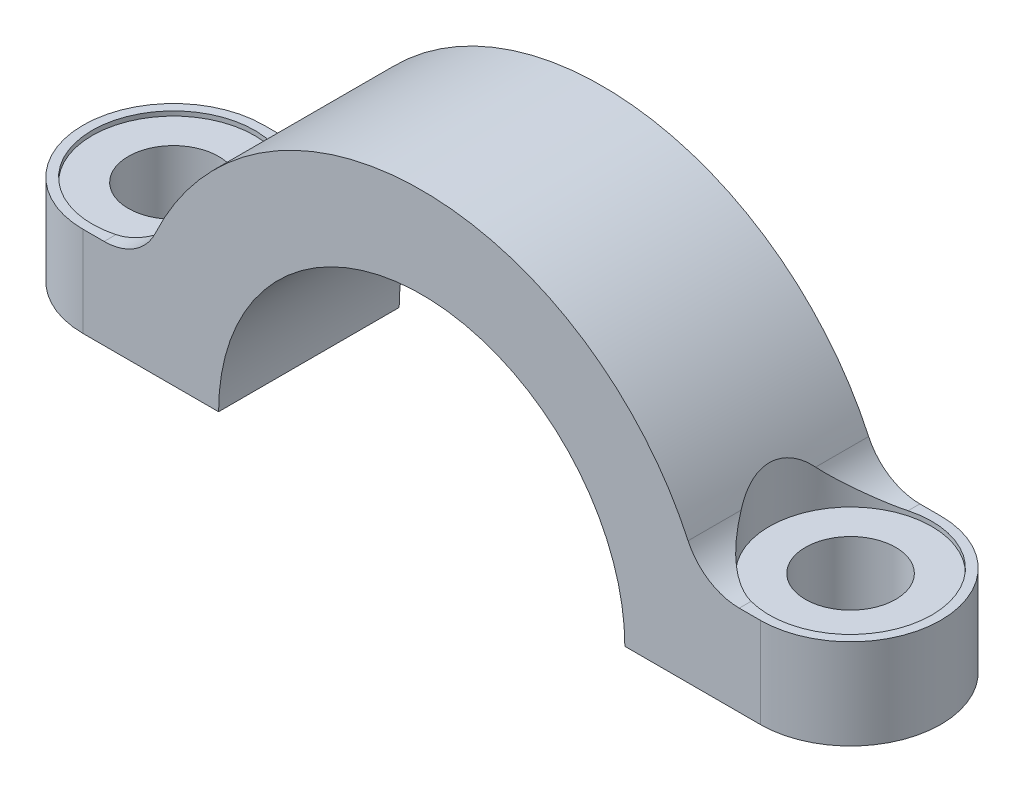
ISO-10303-21;
HEADER;
FILE_DESCRIPTION(('STEP AP214'),'2;1');
FILE_NAME('part.step','',(''),(''),'','','');
FILE_SCHEMA(('AUTOMOTIVE_DESIGN { 1 0 10303 214 1 1 1 1 }'));
ENDSEC;
DATA;
#1=APPLICATION_CONTEXT('core data for automotive mechanical design processes');
#2=APPLICATION_PROTOCOL_DEFINITION('international standard','automotive_design',2000,#1);
#3=PRODUCT_CONTEXT('',#1,'mechanical');
#4=PRODUCT('Part','Part','',(#3));
#5=PRODUCT_RELATED_PRODUCT_CATEGORY('part','',(#4));
#6=PRODUCT_DEFINITION_FORMATION('','',#4);
#7=PRODUCT_DEFINITION_CONTEXT('part definition',#1,'design');
#8=PRODUCT_DEFINITION('design','',#6,#7);
#9=PRODUCT_DEFINITION_SHAPE('','',#8);
#10=(LENGTH_UNIT() NAMED_UNIT(*) SI_UNIT(.MILLI.,.METRE.));
#11=(NAMED_UNIT(*) PLANE_ANGLE_UNIT() SI_UNIT($,.RADIAN.));
#12=(NAMED_UNIT(*) SI_UNIT($,.STERADIAN.) SOLID_ANGLE_UNIT());
#13=UNCERTAINTY_MEASURE_WITH_UNIT(LENGTH_MEASURE(1.E-05),#10,'distance_accuracy_value','');
#14=(GEOMETRIC_REPRESENTATION_CONTEXT(3) GLOBAL_UNCERTAINTY_ASSIGNED_CONTEXT((#13)) GLOBAL_UNIT_ASSIGNED_CONTEXT((#10,
#11,#12)) REPRESENTATION_CONTEXT('',''));
#15=CARTESIAN_POINT('',(0.,0.,0.));
#16=DIRECTION('',(0.,0.,1.));
#17=DIRECTION('',(1.,0.,0.));
#18=AXIS2_PLACEMENT_3D('',#15,#16,#17);
#19=CARTESIAN_POINT('',(14.0712472794703,6.5,4.));
#20=DIRECTION('',(0.,0.,-1.));
#21=DIRECTION('',(-1.,0.,0.));
#22=AXIS2_PLACEMENT_3D('',#19,#20,#21);
#23=CYLINDRICAL_SURFACE('',#22,2.5);
#24=CARTESIAN_POINT('',(11.8016912666525,5.45161290322581,1.65251966590207));
#25=CARTESIAN_POINT('',(11.8188289746263,5.41452420369606,1.68569339481371));
#26=CARTESIAN_POINT('',(11.8367686755661,5.3780649501407,1.71914330040094));
#27=CARTESIAN_POINT('',(11.8742559931517,5.3063196638288,1.78639364698117));
#28=CARTESIAN_POINT('',(11.8938034999538,5.27103355115527,1.82019406388991));
#29=CARTESIAN_POINT('',(11.9548915904636,5.16675750836371,1.92186570037148));
#30=CARTESIAN_POINT('',(11.9988573042518,5.09939392837527,1.98996723746635));
#31=CARTESIAN_POINT('',(12.0937907115289,4.9682446602968,2.12624378968797));
#32=CARTESIAN_POINT('',(12.144819167192,4.90449764120915,2.19441370426769));
#33=CARTESIAN_POINT('',(12.2537120050401,4.78148091019149,2.32925150995004));
#34=CARTESIAN_POINT('',(12.3115741377295,4.72220973538662,2.39591988676886));
#35=CARTESIAN_POINT('',(12.4737368523032,4.57209028407437,2.5689900602577));
#36=CARTESIAN_POINT('',(12.5840339669892,4.48534818048161,2.67347470244523));
#37=CARTESIAN_POINT('',(12.8238677149758,4.32872273657087,2.87203100536794));
#38=CARTESIAN_POINT('',(12.9533455477352,4.25878952732398,2.96613300859957));
#39=CARTESIAN_POINT('',(13.2007259713607,4.15348331978466,3.12074482179418));
#40=CARTESIAN_POINT('',(13.3150405588784,4.11390357215417,3.18411250532934));
#41=CARTESIAN_POINT('',(13.5534866088813,4.0511189168058,3.29924144741269));
#42=CARTESIAN_POINT('',(13.6775916068689,4.02787144143483,3.3510326360635));
#43=CARTESIAN_POINT('',(13.8486925577638,4.00953571992758,3.41125450979519));
#44=CARTESIAN_POINT('',(13.8927666825841,4.00598196212824,3.4258137904709));
#45=CARTESIAN_POINT('',(13.9815577683437,4.0012147374168,3.4532488971905));
#46=CARTESIAN_POINT('',(14.0262746996844,4.00000116309398,3.46612480047347));
#47=CARTESIAN_POINT('',(14.0712472794703,3.9999999999999,3.47813432519632));
#48=B_SPLINE_CURVE_WITH_KNOTS('',3,(#24,#25,#26,#27,#28,#29,#30,#31,#32,#33,#34,#35,#36,#37,#38,
#39,#40,#41,#42,#43,#44,#45,#46,#47),.UNSPECIFIED.,.F.,.F.,(4,2,2,2,2,2,2,2,2,2,2,4),(0.,
0.157860585988416,0.315710396031228,0.631598419231587,0.950395939136866,1.26908880891188,
1.79201855633125,2.31337716780999,2.72156767446074,3.12869030591443,3.26827336571579,
3.40785001872314),.UNSPECIFIED.);
#49=CARTESIAN_POINT('',(11.8016912666525,5.4516129032258,1.65251966590207));
#50=VERTEX_POINT('',#49);
#51=CARTESIAN_POINT('',(14.0712472794703,4.,3.47813432519629));
#52=VERTEX_POINT('',#51);
#53=EDGE_CURVE('E263',#50,#52,#48,.T.);
#54=ORIENTED_EDGE('',*,*,#53,.F.);
#55=DIRECTION('',(0.,0.,-1.));
#56=VECTOR('',#55,1.);
#57=CARTESIAN_POINT('',(11.8016912666525,5.45161290322581,4.));
#58=LINE('',#57,#56);
#59=CARTESIAN_POINT('',(11.8016912666525,5.45161290322581,4.));
#60=VERTEX_POINT('',#59);
#61=EDGE_CURVE('E176',#60,#50,#58,.T.);
#62=ORIENTED_EDGE('',*,*,#61,.F.);
#63=CARTESIAN_POINT('',(14.0712472794703,6.5,4.));
#64=DIRECTION('',(0.,0.,-1.));
#65=DIRECTION('',(-1.,0.,0.));
#66=AXIS2_PLACEMENT_3D('',#63,#64,#65);
#67=CIRCLE('',#66,2.5);
#68=CARTESIAN_POINT('',(14.0712472794703,4.,4.));
#69=VERTEX_POINT('',#68);
#70=EDGE_CURVE('E280',#69,#60,#67,.T.);
#71=ORIENTED_EDGE('',*,*,#70,.F.);
#72=DIRECTION('',(0.,0.,-1.));
#73=VECTOR('',#72,1.);
#74=CARTESIAN_POINT('',(14.0712472794703,4.,4.));
#75=LINE('',#74,#73);
#76=EDGE_CURVE('E180',#69,#52,#75,.T.);
#77=ORIENTED_EDGE('',*,*,#76,.T.);
#78=EDGE_LOOP('',(#54,#62,#71,#77));
#79=FACE_BOUND('',#78,.T.);
#80=ADVANCED_FACE('F41',(#79),#23,.F.);
#81=CARTESIAN_POINT('',(14.0712472794703,4.,-3.4781343251963));
#82=CARTESIAN_POINT('',(14.0032319986114,3.9999879130768,-3.45998969483515));
#83=CARTESIAN_POINT('',(13.9357895006218,4.00277469817216,-3.43982717035992));
#84=CARTESIAN_POINT('',(13.8026519717465,4.01357792717883,-3.39576739876574));
#85=CARTESIAN_POINT('',(13.7369548763053,4.02158787740242,-3.3718748170481));
#86=CARTESIAN_POINT('',(13.6083584672097,4.04237095535814,-3.3208554956094));
#87=CARTESIAN_POINT('',(13.5454383602942,4.05509765294117,-3.29376197979607));
#88=CARTESIAN_POINT('',(13.4220903534515,4.0849172375046,-3.23648440923201));
#89=CARTESIAN_POINT('',(13.3616631839194,4.10201139368336,-3.20629945762985));
#90=CARTESIAN_POINT('',(13.1851558289351,4.15904658994398,-3.1119193230719));
#91=CARTESIAN_POINT('',(13.0731106375179,4.20486806637085,-3.04360078764602));
#92=CARTESIAN_POINT('',(12.8608810391779,4.30931925386273,-2.89841713023571));
#93=CARTESIAN_POINT('',(12.7607369051065,4.36799064584802,-2.82152460499327));
#94=CARTESIAN_POINT('',(12.5223184540677,4.52989626190688,-2.61858113899498));
#95=CARTESIAN_POINT('',(12.3923603348274,4.64016461680518,-2.4882640176697));
#96=CARTESIAN_POINT('',(12.2186739464261,4.81925771350425,-2.28738086447932));
#97=CARTESIAN_POINT('',(12.1642914693542,4.88128256303884,-2.21947203744772));
#98=CARTESIAN_POINT('',(12.0623497656172,5.00968338209213,-2.08265866660381));
#99=CARTESIAN_POINT('',(12.0147873287778,5.07605728294693,-2.01375460816731));
#100=CARTESIAN_POINT('',(11.9389915577287,5.19352180296022,-1.89569029426439));
#101=CARTESIAN_POINT('',(11.9091198004615,5.24355638584064,-1.84651759714745));
#102=CARTESIAN_POINT('',(11.8528488763825,5.34584343690724,-1.74889129918759));
#103=CARTESIAN_POINT('',(11.8264385045383,5.39808798609242,-1.70043585231196));
#104=CARTESIAN_POINT('',(11.8016912666525,5.45161290322581,-1.65251966590208));
#105=B_SPLINE_CURVE_WITH_KNOTS('',3,(#81,#82,#83,#84,#85,#86,#87,#88,#89,#90,#91,#92,#93,#94,
#95,#96,#97,#98,#99,#100,#101,#102,#103,#104),.UNSPECIFIED.,.F.,.F.,(4,2,2,2,2,2,2,2,2,2,2,4),
(0.,0.211046299428013,0.421830715012293,0.630593081425127,0.839416184034417,1.25466964164437,
1.67129053834591,2.31111768515721,2.63145367130033,2.95163837770608,3.18027941162568,
3.40816098787586),.UNSPECIFIED.);
#106=CARTESIAN_POINT('',(14.0712472794703,4.,-3.4781343251963));
#107=VERTEX_POINT('',#106);
#108=CARTESIAN_POINT('',(11.8016912666525,5.45161290322581,-1.65251966590208));
#109=VERTEX_POINT('',#108);
#110=EDGE_CURVE('E62',#107,#109,#105,.T.);
#111=ORIENTED_EDGE('',*,*,#110,.F.);
#112=CARTESIAN_POINT('',(14.0712472794703,4.,-4.));
#113=VERTEX_POINT('',#112);
#114=EDGE_CURVE('E179',#107,#113,#75,.T.);
#115=ORIENTED_EDGE('',*,*,#114,.T.);
#116=CARTESIAN_POINT('',(14.0712472794703,6.5,-4.));
#117=DIRECTION('',(0.,0.,-1.));
#118=DIRECTION('',(-1.,0.,0.));
#119=AXIS2_PLACEMENT_3D('',#116,#117,#118);
#120=CIRCLE('',#119,2.5);
#121=CARTESIAN_POINT('',(11.8016912666525,5.45161290322581,-4.));
#122=VERTEX_POINT('',#121);
#123=EDGE_CURVE('E298',#113,#122,#120,.T.);
#124=ORIENTED_EDGE('',*,*,#123,.T.);
#125=EDGE_CURVE('E175',#109,#122,#58,.T.);
#126=ORIENTED_EDGE('',*,*,#125,.F.);
#127=EDGE_LOOP('',(#111,#115,#124,#126));
#128=FACE_BOUND('',#127,.T.);
#129=ADVANCED_FACE('F259',(#128),#23,.F.);
#130=CARTESIAN_POINT('',(-14.0712472794703,6.5,4.));
#131=DIRECTION('',(0.,0.,-1.));
#132=DIRECTION('',(-1.,0.,0.));
#133=AXIS2_PLACEMENT_3D('',#130,#131,#132);
#134=CYLINDRICAL_SURFACE('',#133,2.5);
#135=CARTESIAN_POINT('',(-14.0712472794703,4.,3.47813432519629));
#136=CARTESIAN_POINT('',(-14.0032319986114,3.99998791307681,3.45998969483515));
#137=CARTESIAN_POINT('',(-13.9357895006218,4.00277469817216,3.43982717035992));
#138=CARTESIAN_POINT('',(-13.8026519717465,4.01357792717883,3.39576739876573));
#139=CARTESIAN_POINT('',(-13.7369548763053,4.02158787740242,3.3718748170481));
#140=CARTESIAN_POINT('',(-13.6083584672097,4.04237095535814,3.3208554956094));
#141=CARTESIAN_POINT('',(-13.5454383602942,4.05509765294117,3.29376197979606));
#142=CARTESIAN_POINT('',(-13.4220903534515,4.0849172375046,3.23648440923201));
#143=CARTESIAN_POINT('',(-13.3616631839194,4.10201139368336,3.20629945762985));
#144=CARTESIAN_POINT('',(-13.1851558289351,4.15904658994398,3.1119193230719));
#145=CARTESIAN_POINT('',(-13.0731106375179,4.20486806637085,3.04360078764602));
#146=CARTESIAN_POINT('',(-12.8608810391779,4.30931925386273,2.89841713023571));
#147=CARTESIAN_POINT('',(-12.7607369051065,4.36799064584801,2.82152460499327));
#148=CARTESIAN_POINT('',(-12.5223184540677,4.52989626190687,2.61858113899498));
#149=CARTESIAN_POINT('',(-12.3923603348274,4.64016461680518,2.4882640176697));
#150=CARTESIAN_POINT('',(-12.2186739464261,4.81925771350424,2.28738086447932));
#151=CARTESIAN_POINT('',(-12.1642914693542,4.88128256303884,2.21947203744771));
#152=CARTESIAN_POINT('',(-12.0623497656172,5.00968338209213,2.0826586666038));
#153=CARTESIAN_POINT('',(-12.0147873287778,5.07605728294693,2.01375460816731));
#154=CARTESIAN_POINT('',(-11.9389915577287,5.19352180296022,1.89569029426439));
#155=CARTESIAN_POINT('',(-11.9091198004615,5.24355638584065,1.84651759714745));
#156=CARTESIAN_POINT('',(-11.8528488763825,5.34584343690724,1.74889129918759));
#157=CARTESIAN_POINT('',(-11.8264385045383,5.39808798609242,1.70043585231196));
#158=CARTESIAN_POINT('',(-11.8016912666525,5.45161290322581,1.65251966590208));
#159=B_SPLINE_CURVE_WITH_KNOTS('',3,(#135,#136,#137,#138,#139,#140,#141,#142,#143,#144,#145,
#146,#147,#148,#149,#150,#151,#152,#153,#154,#155,#156,#157,#158),.UNSPECIFIED.,.F.,.F.,(4,2,2,
2,2,2,2,2,2,2,2,4),(0.,0.211046299428015,0.421830715012293,0.630593081425129,0.839416184034417,
1.25466964164437,1.6712905383459,2.31111768515721,2.63145367130032,2.95163837770608,
3.18027941162569,3.40816098787587),.UNSPECIFIED.);
#160=CARTESIAN_POINT('',(-14.0712472794703,4.,3.47813432519629));
#161=VERTEX_POINT('',#160);
#162=CARTESIAN_POINT('',(-11.8016912666525,5.45161290322581,1.65251966590208));
#163=VERTEX_POINT('',#162);
#164=EDGE_CURVE('E147',#161,#163,#159,.T.);
#165=ORIENTED_EDGE('',*,*,#164,.F.);
#166=DIRECTION('',(0.,0.,-1.));
#167=VECTOR('',#166,1.);
#168=CARTESIAN_POINT('',(-14.0712472794703,4.,4.));
#169=LINE('',#168,#167);
#170=CARTESIAN_POINT('',(-14.0712472794703,4.,4.));
#171=VERTEX_POINT('',#170);
#172=EDGE_CURVE('E158',#171,#161,#169,.T.);
#173=ORIENTED_EDGE('',*,*,#172,.F.);
#174=CARTESIAN_POINT('',(-14.0712472794703,6.5,4.));
#175=DIRECTION('',(0.,0.,-1.));
#176=DIRECTION('',(-1.,0.,0.));
#177=AXIS2_PLACEMENT_3D('',#174,#175,#176);
#178=CIRCLE('',#177,2.5);
#179=CARTESIAN_POINT('',(-11.8016912666525,5.45161290322581,4.));
#180=VERTEX_POINT('',#179);
#181=EDGE_CURVE('E285',#180,#171,#178,.T.);
#182=ORIENTED_EDGE('',*,*,#181,.F.);
#183=DIRECTION('',(0.,0.,-1.));
#184=VECTOR('',#183,1.);
#185=CARTESIAN_POINT('',(-11.8016912666525,5.45161290322581,4.));
#186=LINE('',#185,#184);
#187=EDGE_CURVE('E161',#180,#163,#186,.T.);
#188=ORIENTED_EDGE('',*,*,#187,.T.);
#189=EDGE_LOOP('',(#165,#173,#182,#188));
#190=FACE_BOUND('',#189,.T.);
#191=ADVANCED_FACE('F156',(#190),#134,.F.);
#192=CARTESIAN_POINT('',(-11.8016912666525,5.45161290322581,-1.65251966590208));
#193=CARTESIAN_POINT('',(-11.8188289746263,5.41452420369607,-1.68569339481372));
#194=CARTESIAN_POINT('',(-11.8367686755661,5.3780649501407,-1.71914330040095));
#195=CARTESIAN_POINT('',(-11.8742559931517,5.3063196638288,-1.78639364698118));
#196=CARTESIAN_POINT('',(-11.8938034999538,5.27103355115527,-1.82019406388992));
#197=CARTESIAN_POINT('',(-11.9548915904636,5.16675750836371,-1.92186570037149));
#198=CARTESIAN_POINT('',(-11.9988573042518,5.09939392837527,-1.98996723746635));
#199=CARTESIAN_POINT('',(-12.0937907115289,4.9682446602968,-2.12624378968798));
#200=CARTESIAN_POINT('',(-12.144819167192,4.90449764120915,-2.19441370426769));
#201=CARTESIAN_POINT('',(-12.2537120050401,4.78148091019149,-2.32925150995005));
#202=CARTESIAN_POINT('',(-12.3115741377295,4.72220973538662,-2.39591988676887));
#203=CARTESIAN_POINT('',(-12.4737368523032,4.57209028407438,-2.56899006025771));
#204=CARTESIAN_POINT('',(-12.5840339669892,4.48534818048161,-2.67347470244523));
#205=CARTESIAN_POINT('',(-12.8238677149758,4.32872273657087,-2.87203100536795));
#206=CARTESIAN_POINT('',(-12.9533455477352,4.25878952732398,-2.96613300859957));
#207=CARTESIAN_POINT('',(-13.2007259713607,4.15348331978466,-3.12074482179419));
#208=CARTESIAN_POINT('',(-13.3150405588784,4.11390357215417,-3.18411250532935));
#209=CARTESIAN_POINT('',(-13.5534866088813,4.0511189168058,-3.2992414474127));
#210=CARTESIAN_POINT('',(-13.6775916068689,4.02787144143483,-3.3510326360635));
#211=CARTESIAN_POINT('',(-13.8486925577638,4.00953571992758,-3.41125450979519));
#212=CARTESIAN_POINT('',(-13.8927666825841,4.00598196212824,-3.4258137904709));
#213=CARTESIAN_POINT('',(-13.9815577683437,4.0012147374168,-3.45324889719051));
#214=CARTESIAN_POINT('',(-14.0262746996844,4.00000116309398,-3.46612480047348));
#215=CARTESIAN_POINT('',(-14.0712472794703,3.9999999999999,-3.47813432519633));
#216=B_SPLINE_CURVE_WITH_KNOTS('',3,(#192,#193,#194,#195,#196,#197,#198,#199,#200,#201,#202,
#203,#204,#205,#206,#207,#208,#209,#210,#211,#212,#213,#214,#215),.UNSPECIFIED.,.F.,.F.,(4,2,2,
2,2,2,2,2,2,2,2,4),(0.,0.157860585988416,0.315710396031228,0.631598419231587,0.950395939136867,
1.26908880891188,1.79201855633125,2.31337716780999,2.72156767446073,3.12869030591443,
3.26827336571579,3.40785001872315),.UNSPECIFIED.);
#217=CARTESIAN_POINT('',(-11.8016912666525,5.45161290322581,-1.65251966590208));
#218=VERTEX_POINT('',#217);
#219=CARTESIAN_POINT('',(-14.0712472794703,4.,-3.47813432519629));
#220=VERTEX_POINT('',#219);
#221=EDGE_CURVE('E70',#218,#220,#216,.T.);
#222=ORIENTED_EDGE('',*,*,#221,.F.);
#223=CARTESIAN_POINT('',(-11.8016912666525,5.45161290322581,-4.));
#224=VERTEX_POINT('',#223);
#225=EDGE_CURVE('E167',#218,#224,#186,.T.);
#226=ORIENTED_EDGE('',*,*,#225,.T.);
#227=CARTESIAN_POINT('',(-14.0712472794703,6.5,-4.));
#228=DIRECTION('',(0.,0.,-1.));
#229=DIRECTION('',(-1.,0.,0.));
#230=AXIS2_PLACEMENT_3D('',#227,#228,#229);
#231=CIRCLE('',#230,2.5);
#232=CARTESIAN_POINT('',(-14.0712472794703,4.,-4.));
#233=VERTEX_POINT('',#232);
#234=EDGE_CURVE('E304',#224,#233,#231,.T.);
#235=ORIENTED_EDGE('',*,*,#234,.T.);
#236=EDGE_CURVE('E168',#220,#233,#169,.T.);
#237=ORIENTED_EDGE('',*,*,#236,.F.);
#238=EDGE_LOOP('',(#222,#226,#235,#237));
#239=FACE_BOUND('',#238,.T.);
#240=ADVANCED_FACE('F253',(#239),#134,.F.);
#241=CARTESIAN_POINT('',(0.,0.,4.));
#242=DIRECTION('',(0.,0.,-1.));
#243=DIRECTION('',(-1.,0.,0.));
#244=AXIS2_PLACEMENT_3D('',#241,#242,#243);
#245=CYLINDRICAL_SURFACE('',#244,13.);
#246=CARTESIAN_POINT('',(-11.8016912666525,5.45161290322581,1.65251966590208));
#247=CARTESIAN_POINT('',(-11.7619137019363,5.53780814362832,1.57548012476357));
#248=CARTESIAN_POINT('',(-11.7227848091341,5.61994684893184,1.49296699320704));
#249=CARTESIAN_POINT('',(-11.6476849009631,5.77396122889819,1.31582824393827));
#250=CARTESIAN_POINT('',(-11.6117546383982,5.84571022590225,1.22107610769326));
#251=CARTESIAN_POINT('',(-11.5457206433814,5.97509091428311,1.01942726082592));
#252=CARTESIAN_POINT('',(-11.5156530625301,6.03263556078395,0.912461271660976));
#253=CARTESIAN_POINT('',(-11.4646576493945,6.12899752853031,0.688776664422131));
#254=CARTESIAN_POINT('',(-11.443690017605,6.16789647822427,0.572103229712973));
#255=CARTESIAN_POINT('',(-11.4143109780329,6.22209106245833,0.339990524297711));
#256=CARTESIAN_POINT('',(-11.4051657434658,6.23876837591726,0.224972911142452));
#257=CARTESIAN_POINT('',(-11.3981460398666,6.25158677184615,-0.00661837344641237));
#258=CARTESIAN_POINT('',(-11.4002732793139,6.24772474133057,-0.123192278083928));
#259=CARTESIAN_POINT('',(-11.4143437284637,6.22196930548397,-0.335672743006501));
#260=CARTESIAN_POINT('',(-11.4247566357726,6.20288593907618,-0.43204264364342));
#261=CARTESIAN_POINT('',(-11.4525292435083,6.1514570542709,-0.620071207165806));
#262=CARTESIAN_POINT('',(-11.4698892941514,6.11911086727213,-0.711729632275614));
#263=CARTESIAN_POINT('',(-11.5165752297443,6.03089411022247,-0.916499643465017));
#264=CARTESIAN_POINT('',(-11.5479462304932,5.97082766737508,-1.02732801334705));
#265=CARTESIAN_POINT('',(-11.6172389103602,5.83485729068521,-1.23658587435948));
#266=CARTESIAN_POINT('',(-11.6551732479249,5.75892269264222,-1.33499075844268));
#267=CARTESIAN_POINT('',(-11.7121981947765,5.64145297615188,-1.46705598368692));
#268=CARTESIAN_POINT('',(-11.7298034915953,5.60477036893255,-1.50584029634812));
#269=CARTESIAN_POINT('',(-11.7654465758293,5.52955602870316,-1.58094256149348));
#270=CARTESIAN_POINT('',(-11.7834818103125,5.49103427739538,-1.61727170591447));
#271=CARTESIAN_POINT('',(-11.8016912666525,5.45161290322581,-1.65251966590208));
#272=B_SPLINE_CURVE_WITH_KNOTS('',3,(#246,#247,#248,#249,#250,#251,#252,#253,#254,#255,#256,
#257,#258,#259,#260,#261,#262,#263,#264,#265,#266,#267,#268,#269,#270,#271),.UNSPECIFIED.,.F.,
.F.,(4,2,2,2,2,2,2,2,2,2,2,2,4),(0.,0.367165135052668,0.738485813181745,1.11202841753501,
1.48392041698507,1.83140227606247,2.17893680171119,2.47400731495714,2.76909270503727,
3.15669052659331,3.54504439978402,3.71361625158862,3.88135903120989),.UNSPECIFIED.);
#273=EDGE_CURVE('E162',#163,#218,#272,.T.);
#274=ORIENTED_EDGE('',*,*,#273,.F.);
#275=ORIENTED_EDGE('',*,*,#187,.F.);
#276=CARTESIAN_POINT('',(0.,0.,4.));
#277=DIRECTION('',(0.,0.,1.));
#278=DIRECTION('',(1.,0.,0.));
#279=AXIS2_PLACEMENT_3D('',#276,#277,#278);
#280=CIRCLE('',#279,13.);
#281=EDGE_CURVE('E283',#60,#180,#280,.T.);
#282=ORIENTED_EDGE('',*,*,#281,.F.);
#283=ORIENTED_EDGE('',*,*,#61,.T.);
#284=CARTESIAN_POINT('',(11.8016912666525,5.4516129032258,-1.65251966590208));
#285=CARTESIAN_POINT('',(11.7619137019363,5.53780814362832,-1.57548012476358));
#286=CARTESIAN_POINT('',(11.7227848091341,5.61994684893184,-1.49296699320705));
#287=CARTESIAN_POINT('',(11.6476849009631,5.77396122889819,-1.31582824393828));
#288=CARTESIAN_POINT('',(11.6117546383982,5.84571022590224,-1.22107610769326));
#289=CARTESIAN_POINT('',(11.5457206433814,5.97509091428311,-1.01942726082592));
#290=CARTESIAN_POINT('',(11.5156530625301,6.03263556078395,-0.912461271660981));
#291=CARTESIAN_POINT('',(11.4646576493945,6.12899752853031,-0.688776664422137));
#292=CARTESIAN_POINT('',(11.443690017605,6.16789647822427,-0.572103229712979));
#293=CARTESIAN_POINT('',(11.4143109780329,6.22209106245833,-0.339990524297717));
#294=CARTESIAN_POINT('',(11.4051657434658,6.23876837591726,-0.224972911142458));
#295=CARTESIAN_POINT('',(11.3981460398666,6.25158677184615,0.00661837344640615));
#296=CARTESIAN_POINT('',(11.4002732793139,6.24772474133057,0.123192278083922));
#297=CARTESIAN_POINT('',(11.4143437284637,6.22196930548396,0.335672743006495));
#298=CARTESIAN_POINT('',(11.4247566357726,6.20288593907617,0.432042643643414));
#299=CARTESIAN_POINT('',(11.4525292435083,6.1514570542709,0.6200712071658));
#300=CARTESIAN_POINT('',(11.4698892941514,6.11911086727213,0.711729632275607));
#301=CARTESIAN_POINT('',(11.5165752297443,6.03089411022247,0.91649964346501));
#302=CARTESIAN_POINT('',(11.5479462304932,5.97082766737508,1.02732801334705));
#303=CARTESIAN_POINT('',(11.6172389103602,5.83485729068521,1.23658587435947));
#304=CARTESIAN_POINT('',(11.6551732479249,5.75892269264222,1.33499075844267));
#305=CARTESIAN_POINT('',(11.7121981947765,5.64145297615188,1.46705598368691));
#306=CARTESIAN_POINT('',(11.7298034915953,5.60477036893255,1.50584029634812));
#307=CARTESIAN_POINT('',(11.7654465758293,5.52955602870316,1.58094256149347));
#308=CARTESIAN_POINT('',(11.7834818103125,5.49103427739538,1.61727170591447));
#309=CARTESIAN_POINT('',(11.8016912666525,5.4516129032258,1.65251966590207));
#310=B_SPLINE_CURVE_WITH_KNOTS('',3,(#284,#285,#286,#287,#288,#289,#290,#291,#292,#293,#294,
#295,#296,#297,#298,#299,#300,#301,#302,#303,#304,#305,#306,#307,#308,#309),.UNSPECIFIED.,.F.,
.F.,(4,2,2,2,2,2,2,2,2,2,2,2,4),(0.,0.367165135052668,0.738485813181745,1.11202841753501,
1.48392041698507,1.83140227606247,2.17893680171119,2.47400731495714,2.76909270503727,
3.1566905265933,3.54504439978402,3.71361625158862,3.88135903120989),.UNSPECIFIED.);
#311=EDGE_CURVE('E11',#109,#50,#310,.T.);
#312=ORIENTED_EDGE('',*,*,#311,.F.);
#313=ORIENTED_EDGE('',*,*,#125,.T.);
#314=CARTESIAN_POINT('',(0.,0.,-4.));
#315=DIRECTION('',(0.,0.,1.));
#316=DIRECTION('',(1.,0.,0.));
#317=AXIS2_PLACEMENT_3D('',#314,#315,#316);
#318=CIRCLE('',#317,13.);
#319=EDGE_CURVE('E301',#122,#224,#318,.T.);
#320=ORIENTED_EDGE('',*,*,#319,.T.);
#321=ORIENTED_EDGE('',*,*,#225,.F.);
#322=EDGE_LOOP('',(#274,#275,#282,#283,#312,#313,#320,#321));
#323=FACE_BOUND('',#322,.T.);
#324=ADVANCED_FACE('F249',(#323),#245,.T.);
#325=CARTESIAN_POINT('',(15.,8.,0.));
#326=DIRECTION('',(0.,-1.,0.));
#327=DIRECTION('',(0.,0.,-1.));
#328=AXIS2_PLACEMENT_3D('',#325,#326,#327);
#329=CYLINDRICAL_SURFACE('',#328,2.);
#330=CARTESIAN_POINT('',(15.,0.,0.));
#331=DIRECTION('',(0.,1.,0.));
#332=DIRECTION('',(0.,0.,1.));
#333=AXIS2_PLACEMENT_3D('',#330,#331,#332);
#334=CIRCLE('',#333,2.);
#335=CARTESIAN_POINT('',(15.,0.,2.));
#336=VERTEX_POINT('',#335);
#337=EDGE_CURVE('E271',#336,#336,#334,.T.);
#338=ORIENTED_EDGE('',*,*,#337,.F.);
#339=EDGE_LOOP('',(#338));
#340=FACE_BOUND('',#339,.T.);
#341=CARTESIAN_POINT('',(15.,3.8,0.));
#342=DIRECTION('',(0.,1.,0.));
#343=DIRECTION('',(0.,0.,1.));
#344=AXIS2_PLACEMENT_3D('',#341,#342,#343);
#345=CIRCLE('',#344,2.);
#346=CARTESIAN_POINT('',(15.,3.8,2.));
#347=VERTEX_POINT('',#346);
#348=EDGE_CURVE('E205',#347,#347,#345,.T.);
#349=ORIENTED_EDGE('',*,*,#348,.T.);
#350=EDGE_LOOP('',(#349));
#351=FACE_BOUND('',#350,.T.);
#352=ADVANCED_FACE('F252',(#340,#351),#329,.F.);
#353=CARTESIAN_POINT('',(-15.,8.,0.));
#354=DIRECTION('',(0.,-1.,0.));
#355=DIRECTION('',(0.,0.,-1.));
#356=AXIS2_PLACEMENT_3D('',#353,#354,#355);
#357=CYLINDRICAL_SURFACE('',#356,2.);
#358=CARTESIAN_POINT('',(-15.,0.,0.));
#359=DIRECTION('',(0.,1.,0.));
#360=DIRECTION('',(0.,0.,1.));
#361=AXIS2_PLACEMENT_3D('',#358,#359,#360);
#362=CIRCLE('',#361,2.);
#363=CARTESIAN_POINT('',(-15.,0.,2.));
#364=VERTEX_POINT('',#363);
#365=EDGE_CURVE('E272',#364,#364,#362,.T.);
#366=ORIENTED_EDGE('',*,*,#365,.F.);
#367=EDGE_LOOP('',(#366));
#368=FACE_BOUND('',#367,.T.);
#369=CARTESIAN_POINT('',(-15.,3.8,0.));
#370=DIRECTION('',(0.,1.,0.));
#371=DIRECTION('',(0.,0.,1.));
#372=AXIS2_PLACEMENT_3D('',#369,#370,#371);
#373=CIRCLE('',#372,2.);
#374=CARTESIAN_POINT('',(-15.,3.8,2.));
#375=VERTEX_POINT('',#374);
#376=EDGE_CURVE('E202',#375,#375,#373,.T.);
#377=ORIENTED_EDGE('',*,*,#376,.T.);
#378=EDGE_LOOP('',(#377));
#379=FACE_BOUND('',#378,.T.);
#380=ADVANCED_FACE('F378',(#368,#379),#357,.F.);
#381=CARTESIAN_POINT('',(-15.,4.,0.));
#382=DIRECTION('',(0.,-1.,0.));
#383=DIRECTION('',(0.,0.,-1.));
#384=AXIS2_PLACEMENT_3D('',#381,#382,#383);
#385=CYLINDRICAL_SURFACE('',#384,4.);
#386=DIRECTION('',(0.,1.,0.));
#387=VECTOR('',#386,1.);
#388=CARTESIAN_POINT('',(-15.,4.,4.));
#389=LINE('',#388,#387);
#390=CARTESIAN_POINT('',(-15.,4.,4.));
#391=VERTEX_POINT('',#390);
#392=CARTESIAN_POINT('',(-15.,0.,4.));
#393=VERTEX_POINT('',#392);
#394=EDGE_CURVE('E193',#391,#393,#389,.F.);
#395=ORIENTED_EDGE('',*,*,#394,.F.);
#396=CARTESIAN_POINT('',(-15.,4.,0.));
#397=DIRECTION('',(0.,-1.,0.));
#398=DIRECTION('',(0.,0.,-1.));
#399=AXIS2_PLACEMENT_3D('',#396,#397,#398);
#400=CIRCLE('',#399,4.);
#401=CARTESIAN_POINT('',(-15.,4.,-4.));
#402=VERTEX_POINT('',#401);
#403=EDGE_CURVE('E199',#402,#391,#400,.F.);
#404=ORIENTED_EDGE('',*,*,#403,.F.);
#405=DIRECTION('',(0.,-1.,0.));
#406=VECTOR('',#405,1.);
#407=CARTESIAN_POINT('',(-15.,0.,-4.));
#408=LINE('',#407,#406);
#409=CARTESIAN_POINT('',(-15.,0.,-4.));
#410=VERTEX_POINT('',#409);
#411=EDGE_CURVE('E196',#410,#402,#408,.F.);
#412=ORIENTED_EDGE('',*,*,#411,.F.);
#413=CARTESIAN_POINT('',(-15.,0.,0.));
#414=DIRECTION('',(0.,1.,0.));
#415=DIRECTION('',(-1.,0.,0.));
#416=AXIS2_PLACEMENT_3D('',#413,#414,#415);
#417=CIRCLE('',#416,4.);
#418=EDGE_CURVE('E152',#393,#410,#417,.F.);
#419=ORIENTED_EDGE('',*,*,#418,.F.);
#420=EDGE_LOOP('',(#395,#404,#412,#419));
#421=FACE_BOUND('',#420,.T.);
#422=ADVANCED_FACE('F44',(#421),#385,.T.);
#423=CARTESIAN_POINT('',(15.,0.,0.));
#424=DIRECTION('',(0.,1.,0.));
#425=DIRECTION('',(0.,0.,1.));
#426=AXIS2_PLACEMENT_3D('',#423,#424,#425);
#427=CYLINDRICAL_SURFACE('',#426,4.);
#428=DIRECTION('',(0.,-1.,0.));
#429=VECTOR('',#428,1.);
#430=CARTESIAN_POINT('',(15.,0.,4.));
#431=LINE('',#430,#429);
#432=CARTESIAN_POINT('',(15.,0.,4.));
#433=VERTEX_POINT('',#432);
#434=CARTESIAN_POINT('',(15.,4.,4.));
#435=VERTEX_POINT('',#434);
#436=EDGE_CURVE('E183',#433,#435,#431,.F.);
#437=ORIENTED_EDGE('',*,*,#436,.F.);
#438=CARTESIAN_POINT('',(15.,0.,0.));
#439=DIRECTION('',(0.,1.,0.));
#440=DIRECTION('',(-1.,0.,0.));
#441=AXIS2_PLACEMENT_3D('',#438,#439,#440);
#442=CIRCLE('',#441,4.);
#443=CARTESIAN_POINT('',(15.,0.,-4.));
#444=VERTEX_POINT('',#443);
#445=EDGE_CURVE('E189',#444,#433,#442,.F.);
#446=ORIENTED_EDGE('',*,*,#445,.F.);
#447=DIRECTION('',(0.,1.,0.));
#448=VECTOR('',#447,1.);
#449=CARTESIAN_POINT('',(15.,0.,-4.));
#450=LINE('',#449,#448);
#451=CARTESIAN_POINT('',(15.,4.,-4.));
#452=VERTEX_POINT('',#451);
#453=EDGE_CURVE('E186',#452,#444,#450,.F.);
#454=ORIENTED_EDGE('',*,*,#453,.F.);
#455=CARTESIAN_POINT('',(15.,4.,0.));
#456=DIRECTION('',(0.,-1.,0.));
#457=DIRECTION('',(0.,0.,-1.));
#458=AXIS2_PLACEMENT_3D('',#455,#456,#457);
#459=CIRCLE('',#458,4.);
#460=EDGE_CURVE('E191',#435,#452,#459,.F.);
#461=ORIENTED_EDGE('',*,*,#460,.F.);
#462=EDGE_LOOP('',(#437,#446,#454,#461));
#463=FACE_BOUND('',#462,.T.);
#464=ADVANCED_FACE('F335',(#463),#427,.T.);
#465=CARTESIAN_POINT('',(14.0712472794703,4.,4.));
#466=DIRECTION('',(0.,-1.,0.));
#467=DIRECTION('',(0.,0.,-1.));
#468=AXIS2_PLACEMENT_3D('',#465,#466,#467);
#469=PLANE('',#468);
#470=CARTESIAN_POINT('',(15.,4.,0.));
#471=DIRECTION('',(0.,-1.,0.));
#472=DIRECTION('',(0.,0.,-1.));
#473=AXIS2_PLACEMENT_3D('',#470,#471,#472);
#474=CIRCLE('',#473,3.6);
#475=EDGE_CURVE('E269',#52,#107,#474,.F.);
#476=ORIENTED_EDGE('',*,*,#475,.F.);
#477=ORIENTED_EDGE('',*,*,#76,.F.);
#478=DIRECTION('',(-1.,0.,0.));
#479=VECTOR('',#478,1.);
#480=CARTESIAN_POINT('',(14.0712472794703,4.,4.));
#481=LINE('',#480,#479);
#482=EDGE_CURVE('E278',#435,#69,#481,.T.);
#483=ORIENTED_EDGE('',*,*,#482,.F.);
#484=ORIENTED_EDGE('',*,*,#460,.T.);
#485=DIRECTION('',(-1.,0.,0.));
#486=VECTOR('',#485,1.);
#487=CARTESIAN_POINT('',(14.0712472794703,4.,-4.));
#488=LINE('',#487,#486);
#489=EDGE_CURVE('E275',#452,#113,#488,.T.);
#490=ORIENTED_EDGE('',*,*,#489,.T.);
#491=ORIENTED_EDGE('',*,*,#114,.F.);
#492=EDGE_LOOP('',(#476,#477,#483,#484,#490,#491));
#493=FACE_BOUND('',#492,.T.);
#494=ADVANCED_FACE('F261',(#493),#469,.F.);
#495=CARTESIAN_POINT('',(-19.,4.,4.));
#496=DIRECTION('',(0.,-1.,0.));
#497=DIRECTION('',(0.,0.,-1.));
#498=AXIS2_PLACEMENT_3D('',#495,#496,#497);
#499=PLANE('',#498);
#500=CARTESIAN_POINT('',(-15.,4.,0.));
#501=DIRECTION('',(0.,-1.,0.));
#502=DIRECTION('',(0.,0.,-1.));
#503=AXIS2_PLACEMENT_3D('',#500,#501,#502);
#504=CIRCLE('',#503,3.6);
#505=EDGE_CURVE('E56',#220,#161,#504,.F.);
#506=ORIENTED_EDGE('',*,*,#505,.F.);
#507=ORIENTED_EDGE('',*,*,#236,.T.);
#508=DIRECTION('',(-1.,0.,0.));
#509=VECTOR('',#508,1.);
#510=CARTESIAN_POINT('',(-19.,4.,-4.));
#511=LINE('',#510,#509);
#512=EDGE_CURVE('E307',#233,#402,#511,.T.);
#513=ORIENTED_EDGE('',*,*,#512,.T.);
#514=ORIENTED_EDGE('',*,*,#403,.T.);
#515=DIRECTION('',(-1.,0.,0.));
#516=VECTOR('',#515,1.);
#517=CARTESIAN_POINT('',(-19.,4.,4.));
#518=LINE('',#517,#516);
#519=EDGE_CURVE('E166',#171,#391,#518,.T.);
#520=ORIENTED_EDGE('',*,*,#519,.F.);
#521=ORIENTED_EDGE('',*,*,#172,.T.);
#522=EDGE_LOOP('',(#506,#507,#513,#514,#520,#521));
#523=FACE_BOUND('',#522,.T.);
#524=ADVANCED_FACE('F164',(#523),#499,.F.);
#525=CARTESIAN_POINT('',(-19.,0.,4.));
#526=DIRECTION('',(0.,1.,0.));
#527=DIRECTION('',(-1.,0.,0.));
#528=AXIS2_PLACEMENT_3D('',#525,#526,#527);
#529=PLANE('',#528);
#530=ORIENTED_EDGE('',*,*,#365,.T.);
#531=EDGE_LOOP('',(#530));
#532=FACE_BOUND('',#531,.T.);
#533=DIRECTION('',(1.,0.,0.));
#534=VECTOR('',#533,1.);
#535=CARTESIAN_POINT('',(-19.,0.,4.));
#536=LINE('',#535,#534);
#537=CARTESIAN_POINT('',(-9.,0.,4.));
#538=VERTEX_POINT('',#537);
#539=EDGE_CURVE('E288',#393,#538,#536,.T.);
#540=ORIENTED_EDGE('',*,*,#539,.F.);
#541=ORIENTED_EDGE('',*,*,#418,.T.);
#542=DIRECTION('',(1.,0.,0.));
#543=VECTOR('',#542,1.);
#544=CARTESIAN_POINT('',(-19.,0.,-4.));
#545=LINE('',#544,#543);
#546=CARTESIAN_POINT('',(-9.,0.,-4.));
#547=VERTEX_POINT('',#546);
#548=EDGE_CURVE('E310',#410,#547,#545,.T.);
#549=ORIENTED_EDGE('',*,*,#548,.T.);
#550=DIRECTION('',(0.,0.,-1.));
#551=VECTOR('',#550,1.);
#552=CARTESIAN_POINT('',(-9.,0.,4.));
#553=LINE('',#552,#551);
#554=EDGE_CURVE('E171',#538,#547,#553,.T.);
#555=ORIENTED_EDGE('',*,*,#554,.F.);
#556=EDGE_LOOP('',(#540,#541,#549,#555));
#557=FACE_BOUND('',#556,.T.);
#558=ADVANCED_FACE('F340',(#532,#557),#529,.F.);
#559=CARTESIAN_POINT('',(0.,0.,4.));
#560=DIRECTION('',(0.,0.,-1.));
#561=DIRECTION('',(-1.,0.,0.));
#562=AXIS2_PLACEMENT_3D('',#559,#560,#561);
#563=CYLINDRICAL_SURFACE('',#562,9.);
#564=CARTESIAN_POINT('',(0.,0.,-4.));
#565=DIRECTION('',(0.,0.,-1.));
#566=DIRECTION('',(1.,0.,0.));
#567=AXIS2_PLACEMENT_3D('',#564,#565,#566);
#568=CIRCLE('',#567,9.);
#569=CARTESIAN_POINT('',(9.,0.,-4.));
#570=VERTEX_POINT('',#569);
#571=EDGE_CURVE('E312',#547,#570,#568,.T.);
#572=ORIENTED_EDGE('',*,*,#571,.T.);
#573=DIRECTION('',(0.,0.,-1.));
#574=VECTOR('',#573,1.);
#575=CARTESIAN_POINT('',(9.,0.,4.));
#576=LINE('',#575,#574);
#577=CARTESIAN_POINT('',(9.,0.,4.));
#578=VERTEX_POINT('',#577);
#579=EDGE_CURVE('E295',#578,#570,#576,.T.);
#580=ORIENTED_EDGE('',*,*,#579,.F.);
#581=CARTESIAN_POINT('',(0.,0.,4.));
#582=DIRECTION('',(0.,0.,-1.));
#583=DIRECTION('',(1.,0.,0.));
#584=AXIS2_PLACEMENT_3D('',#581,#582,#583);
#585=CIRCLE('',#584,9.);
#586=EDGE_CURVE('E290',#538,#578,#585,.T.);
#587=ORIENTED_EDGE('',*,*,#586,.F.);
#588=ORIENTED_EDGE('',*,*,#554,.T.);
#589=EDGE_LOOP('',(#572,#580,#587,#588));
#590=FACE_BOUND('',#589,.T.);
#591=ADVANCED_FACE('F325',(#590),#563,.F.);
#592=CARTESIAN_POINT('',(9.,0.,4.));
#593=DIRECTION('',(0.,1.,0.));
#594=DIRECTION('',(-1.,0.,0.));
#595=AXIS2_PLACEMENT_3D('',#592,#593,#594);
#596=PLANE('',#595);
#597=ORIENTED_EDGE('',*,*,#337,.T.);
#598=EDGE_LOOP('',(#597));
#599=FACE_BOUND('',#598,.T.);
#600=DIRECTION('',(1.,0.,0.));
#601=VECTOR('',#600,1.);
#602=CARTESIAN_POINT('',(9.,0.,-4.));
#603=LINE('',#602,#601);
#604=EDGE_CURVE('E281',#570,#444,#603,.T.);
#605=ORIENTED_EDGE('',*,*,#604,.T.);
#606=ORIENTED_EDGE('',*,*,#445,.T.);
#607=DIRECTION('',(1.,0.,0.));
#608=VECTOR('',#607,1.);
#609=CARTESIAN_POINT('',(9.,0.,4.));
#610=LINE('',#609,#608);
#611=EDGE_CURVE('E292',#578,#433,#610,.T.);
#612=ORIENTED_EDGE('',*,*,#611,.F.);
#613=ORIENTED_EDGE('',*,*,#579,.T.);
#614=EDGE_LOOP('',(#605,#606,#612,#613));
#615=FACE_BOUND('',#614,.T.);
#616=ADVANCED_FACE('F332',(#599,#615),#596,.F.);
#617=CARTESIAN_POINT('',(0.,0.,4.));
#618=DIRECTION('',(0.,0.,1.));
#619=DIRECTION('',(1.,0.,0.));
#620=AXIS2_PLACEMENT_3D('',#617,#618,#619);
#621=PLANE('',#620);
#622=ORIENTED_EDGE('',*,*,#519,.T.);
#623=ORIENTED_EDGE('',*,*,#394,.T.);
#624=ORIENTED_EDGE('',*,*,#539,.T.);
#625=ORIENTED_EDGE('',*,*,#586,.T.);
#626=ORIENTED_EDGE('',*,*,#611,.T.);
#627=ORIENTED_EDGE('',*,*,#436,.T.);
#628=ORIENTED_EDGE('',*,*,#482,.T.);
#629=ORIENTED_EDGE('',*,*,#70,.T.);
#630=ORIENTED_EDGE('',*,*,#281,.T.);
#631=ORIENTED_EDGE('',*,*,#181,.T.);
#632=EDGE_LOOP('',(#622,#623,#624,#625,#626,#627,#628,#629,#630,#631));
#633=FACE_BOUND('',#632,.T.);
#634=ADVANCED_FACE('F338',(#633),#621,.T.);
#635=CARTESIAN_POINT('',(0.,0.,-4.));
#636=DIRECTION('',(0.,0.,1.));
#637=DIRECTION('',(1.,0.,0.));
#638=AXIS2_PLACEMENT_3D('',#635,#636,#637);
#639=PLANE('',#638);
#640=ORIENTED_EDGE('',*,*,#548,.F.);
#641=ORIENTED_EDGE('',*,*,#411,.T.);
#642=ORIENTED_EDGE('',*,*,#512,.F.);
#643=ORIENTED_EDGE('',*,*,#234,.F.);
#644=ORIENTED_EDGE('',*,*,#319,.F.);
#645=ORIENTED_EDGE('',*,*,#123,.F.);
#646=ORIENTED_EDGE('',*,*,#489,.F.);
#647=ORIENTED_EDGE('',*,*,#453,.T.);
#648=ORIENTED_EDGE('',*,*,#604,.F.);
#649=ORIENTED_EDGE('',*,*,#571,.F.);
#650=EDGE_LOOP('',(#640,#641,#642,#643,#644,#645,#646,#647,#648,#649));
#651=FACE_BOUND('',#650,.T.);
#652=ADVANCED_FACE('F231',(#651),#639,.F.);
#653=CARTESIAN_POINT('',(-15.,11.8,0.));
#654=DIRECTION('',(0.,-1.,0.));
#655=DIRECTION('',(0.,0.,-1.));
#656=AXIS2_PLACEMENT_3D('',#653,#654,#655);
#657=CYLINDRICAL_SURFACE('',#656,3.6);
#658=CARTESIAN_POINT('',(-15.,3.8,0.));
#659=DIRECTION('',(0.,1.,0.));
#660=DIRECTION('',(0.,0.,1.));
#661=AXIS2_PLACEMENT_3D('',#658,#659,#660);
#662=CIRCLE('',#661,3.6);
#663=CARTESIAN_POINT('',(-15.,3.8,3.6));
#664=VERTEX_POINT('',#663);
#665=EDGE_CURVE('E206',#664,#664,#662,.T.);
#666=ORIENTED_EDGE('',*,*,#665,.F.);
#667=EDGE_LOOP('',(#666));
#668=FACE_BOUND('',#667,.T.);
#669=ORIENTED_EDGE('',*,*,#273,.T.);
#670=ORIENTED_EDGE('',*,*,#221,.T.);
#671=ORIENTED_EDGE('',*,*,#505,.T.);
#672=ORIENTED_EDGE('',*,*,#164,.T.);
#673=EDGE_LOOP('',(#669,#670,#671,#672));
#674=FACE_BOUND('',#673,.T.);
#675=ADVANCED_FACE('F146',(#668,#674),#657,.F.);
#676=CARTESIAN_POINT('',(-15.,3.8,0.));
#677=DIRECTION('',(0.,1.,0.));
#678=DIRECTION('',(0.,0.,1.));
#679=AXIS2_PLACEMENT_3D('',#676,#677,#678);
#680=PLANE('',#679);
#681=ORIENTED_EDGE('',*,*,#376,.F.);
#682=EDGE_LOOP('',(#681));
#683=FACE_BOUND('',#682,.T.);
#684=ORIENTED_EDGE('',*,*,#665,.T.);
#685=EDGE_LOOP('',(#684));
#686=FACE_BOUND('',#685,.T.);
#687=ADVANCED_FACE('F230',(#683,#686),#680,.T.);
#688=CARTESIAN_POINT('',(15.,11.8,0.));
#689=DIRECTION('',(0.,-1.,0.));
#690=DIRECTION('',(0.,0.,-1.));
#691=AXIS2_PLACEMENT_3D('',#688,#689,#690);
#692=CYLINDRICAL_SURFACE('',#691,3.6);
#693=CARTESIAN_POINT('',(15.,3.8,0.));
#694=DIRECTION('',(0.,1.,0.));
#695=DIRECTION('',(0.,0.,1.));
#696=AXIS2_PLACEMENT_3D('',#693,#694,#695);
#697=CIRCLE('',#696,3.6);
#698=CARTESIAN_POINT('',(15.,3.8,3.59999999999999));
#699=VERTEX_POINT('',#698);
#700=EDGE_CURVE('E218',#699,#699,#697,.T.);
#701=ORIENTED_EDGE('',*,*,#700,.F.);
#702=EDGE_LOOP('',(#701));
#703=FACE_BOUND('',#702,.T.);
#704=ORIENTED_EDGE('',*,*,#475,.T.);
#705=ORIENTED_EDGE('',*,*,#110,.T.);
#706=ORIENTED_EDGE('',*,*,#311,.T.);
#707=ORIENTED_EDGE('',*,*,#53,.T.);
#708=EDGE_LOOP('',(#704,#705,#706,#707));
#709=FACE_BOUND('',#708,.T.);
#710=ADVANCED_FACE('F233',(#703,#709),#692,.F.);
#711=CARTESIAN_POINT('',(15.,3.8,0.));
#712=DIRECTION('',(0.,1.,0.));
#713=DIRECTION('',(0.,0.,1.));
#714=AXIS2_PLACEMENT_3D('',#711,#712,#713);
#715=PLANE('',#714);
#716=ORIENTED_EDGE('',*,*,#348,.F.);
#717=EDGE_LOOP('',(#716));
#718=FACE_BOUND('',#717,.T.);
#719=ORIENTED_EDGE('',*,*,#700,.T.);
#720=EDGE_LOOP('',(#719));
#721=FACE_BOUND('',#720,.T.);
#722=ADVANCED_FACE('F360',(#718,#721),#715,.T.);
#723=CLOSED_SHELL('',(#80,#129,#191,#240,#324,#352,#380,#422,#464,#494,#524,#558,#591,#616,#634,
#652,#675,#687,#710,#722));
#724=MANIFOLD_SOLID_BREP('B2',#723);
#725=ADVANCED_BREP_SHAPE_REPRESENTATION('',(#18,#724),#14);
#726=SHAPE_DEFINITION_REPRESENTATION(#9,#725);
ENDSEC;
END-ISO-10303-21;
